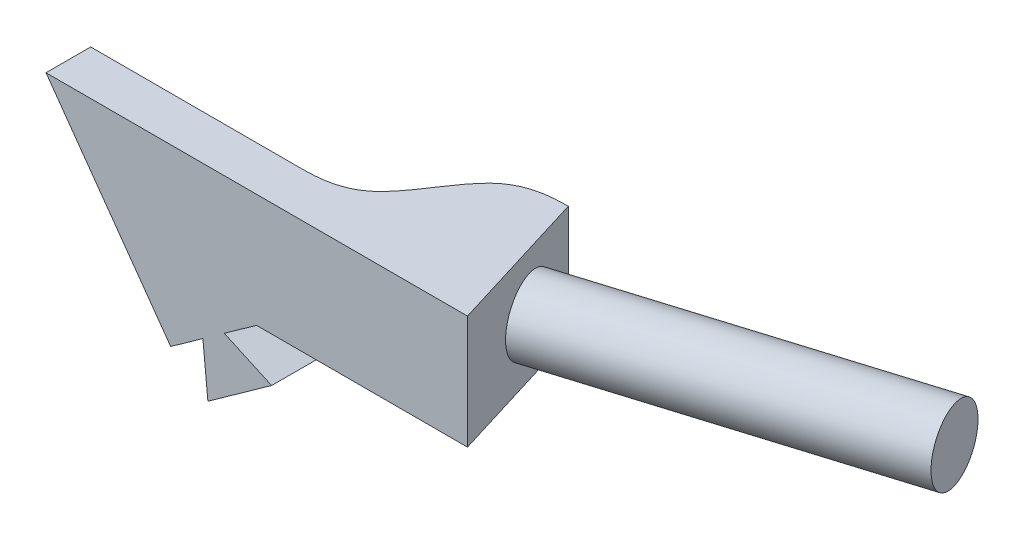
ISO-10303-21;
HEADER;
FILE_DESCRIPTION(('STEP AP214'),'2;1');
FILE_NAME('part.step','',(''),(''),'','','');
FILE_SCHEMA(('AUTOMOTIVE_DESIGN { 1 0 10303 214 1 1 1 1 }'));
ENDSEC;
DATA;
#1=APPLICATION_CONTEXT('core data for automotive mechanical design processes');
#2=APPLICATION_PROTOCOL_DEFINITION('international standard','automotive_design',2000,#1);
#3=PRODUCT_CONTEXT('',#1,'mechanical');
#4=PRODUCT('Part','Part','',(#3));
#5=PRODUCT_RELATED_PRODUCT_CATEGORY('part','',(#4));
#6=PRODUCT_DEFINITION_FORMATION('','',#4);
#7=PRODUCT_DEFINITION_CONTEXT('part definition',#1,'design');
#8=PRODUCT_DEFINITION('design','',#6,#7);
#9=PRODUCT_DEFINITION_SHAPE('','',#8);
#10=(LENGTH_UNIT() NAMED_UNIT(*) SI_UNIT(.MILLI.,.METRE.));
#11=(NAMED_UNIT(*) PLANE_ANGLE_UNIT() SI_UNIT($,.RADIAN.));
#12=(NAMED_UNIT(*) SI_UNIT($,.STERADIAN.) SOLID_ANGLE_UNIT());
#13=UNCERTAINTY_MEASURE_WITH_UNIT(LENGTH_MEASURE(1.E-05),#10,'distance_accuracy_value','');
#14=(GEOMETRIC_REPRESENTATION_CONTEXT(3) GLOBAL_UNCERTAINTY_ASSIGNED_CONTEXT((#13)) GLOBAL_UNIT_ASSIGNED_CONTEXT((#10,
#11,#12)) REPRESENTATION_CONTEXT('',''));
#15=CARTESIAN_POINT('',(0.,0.,0.));
#16=DIRECTION('',(0.,0.,1.));
#17=DIRECTION('',(1.,0.,0.));
#18=AXIS2_PLACEMENT_3D('',#15,#16,#17);
#19=CARTESIAN_POINT('',(-38.1,-12.7,-19.878167));
#20=DIRECTION('',(0.,-1.,0.));
#21=DIRECTION('',(0.,0.,-1.));
#22=AXIS2_PLACEMENT_3D('',#19,#20,#21);
#23=PLANE('',#22);
#24=DIRECTION('',(1.,0.,0.));
#25=VECTOR('',#24,1.);
#26=CARTESIAN_POINT('',(-38.1,-12.7,12.7));
#27=LINE('',#26,#25);
#28=CARTESIAN_POINT('',(-9.1056461346017,-12.7,12.7));
#29=VERTEX_POINT('',#28);
#30=CARTESIAN_POINT('',(38.0999999999999,-12.7,12.7));
#31=VERTEX_POINT('',#30);
#32=EDGE_CURVE('E72',#29,#31,#27,.T.);
#33=ORIENTED_EDGE('',*,*,#32,.F.);
#34=DIRECTION('',(0.,0.,-1.));
#35=VECTOR('',#34,1.);
#36=CARTESIAN_POINT('',(-9.10564613460171,-12.7,44.7712332532875));
#37=LINE('',#36,#35);
#38=CARTESIAN_POINT('',(-9.1056461346017,-12.7,2.7));
#39=VERTEX_POINT('',#38);
#40=EDGE_CURVE('E180',#29,#39,#37,.T.);
#41=ORIENTED_EDGE('',*,*,#40,.T.);
#42=CARTESIAN_POINT('',(28.0956449744943,-12.7,-19.878167));
#43=CARTESIAN_POINT('',(23.2624762333461,-12.7,-19.878167));
#44=CARTESIAN_POINT('',(13.7597257234162,-12.7,-18.3882704900342));
#45=CARTESIAN_POINT('',(5.19295176017358,-12.7,1.21010349003423));
#46=CARTESIAN_POINT('',(-4.18514201423128,-12.7,2.7));
#47=CARTESIAN_POINT('',(-9.1056461346017,-12.7,2.7));
#48=B_SPLINE_CURVE_WITH_KNOTS('',3,(#42,#43,#44,#45,#46,#47),.UNSPECIFIED.,.F.,.F.,(4,1,1,4),
(0.,0.311689084079751,0.688310915920249,1.),.UNSPECIFIED.);
#49=CARTESIAN_POINT('',(28.0956449744943,-12.7,-19.878167));
#50=VERTEX_POINT('',#49);
#51=EDGE_CURVE('E220',#50,#39,#48,.T.);
#52=ORIENTED_EDGE('',*,*,#51,.F.);
#53=DIRECTION('',(0.293557838503509,0.,0.95594131381228));
#54=VECTOR('',#53,1.);
#55=CARTESIAN_POINT('',(31.2527609708644,-12.7,-9.59733910995649));
#56=LINE('',#55,#54);
#57=EDGE_CURVE('E87',#50,#31,#56,.T.);
#58=ORIENTED_EDGE('',*,*,#57,.T.);
#59=EDGE_LOOP('',(#33,#41,#52,#58));
#60=FACE_BOUND('',#59,.T.);
#61=ADVANCED_FACE('F68',(#60),#23,.T.);
#62=CARTESIAN_POINT('',(-38.1,12.7,-19.878167));
#63=DIRECTION('',(0.,1.,0.));
#64=DIRECTION('',(0.,0.,1.));
#65=AXIS2_PLACEMENT_3D('',#62,#63,#64);
#66=PLANE('',#65);
#67=DIRECTION('',(-1.,0.,0.));
#68=VECTOR('',#67,1.);
#69=CARTESIAN_POINT('',(-38.1,12.7,12.7));
#70=LINE('',#69,#68);
#71=CARTESIAN_POINT('',(38.0999999999999,12.7,12.7));
#72=VERTEX_POINT('',#71);
#73=CARTESIAN_POINT('',(-56.2176439245838,12.7,12.7));
#74=VERTEX_POINT('',#73);
#75=EDGE_CURVE('E264',#72,#74,#70,.T.);
#76=ORIENTED_EDGE('',*,*,#75,.F.);
#77=DIRECTION('',(0.293557838503509,0.,0.95594131381228));
#78=VECTOR('',#77,1.);
#79=CARTESIAN_POINT('',(31.2527609708644,12.7,-9.59733910995649));
#80=LINE('',#79,#78);
#81=CARTESIAN_POINT('',(28.0956449744943,12.7,-19.878167));
#82=VERTEX_POINT('',#81);
#83=EDGE_CURVE('E216',#82,#72,#80,.T.);
#84=ORIENTED_EDGE('',*,*,#83,.F.);
#85=CARTESIAN_POINT('',(28.0956449744943,12.7,-19.878167));
#86=CARTESIAN_POINT('',(23.2624762333461,12.7,-19.878167));
#87=CARTESIAN_POINT('',(13.7597257234162,12.7,-18.3882704900342));
#88=CARTESIAN_POINT('',(5.19295176017358,12.7,1.21010349003423));
#89=CARTESIAN_POINT('',(-4.18514201423128,12.7,2.7));
#90=CARTESIAN_POINT('',(-9.1056461346017,12.7,2.7));
#91=B_SPLINE_CURVE_WITH_KNOTS('',3,(#85,#86,#87,#88,#89,#90),.UNSPECIFIED.,.F.,.F.,(4,1,1,4),
(0.,0.311689084079751,0.688310915920249,1.),.UNSPECIFIED.);
#92=CARTESIAN_POINT('',(-9.1056461346017,12.7,2.7));
#93=VERTEX_POINT('',#92);
#94=EDGE_CURVE('E228',#82,#93,#91,.T.);
#95=ORIENTED_EDGE('',*,*,#94,.T.);
#96=DIRECTION('',(-1.,0.,0.));
#97=VECTOR('',#96,1.);
#98=CARTESIAN_POINT('',(-9.1056461346017,12.7,2.7));
#99=LINE('',#98,#97);
#100=CARTESIAN_POINT('',(-56.2176439245837,12.7,2.69999999999999));
#101=VERTEX_POINT('',#100);
#102=EDGE_CURVE('E235',#93,#101,#99,.T.);
#103=ORIENTED_EDGE('',*,*,#102,.T.);
#104=DIRECTION('',(0.,0.,-1.));
#105=VECTOR('',#104,1.);
#106=CARTESIAN_POINT('',(-56.2176439245838,12.7,44.7712332532875));
#107=LINE('',#106,#105);
#108=EDGE_CURVE('E148',#74,#101,#107,.T.);
#109=ORIENTED_EDGE('',*,*,#108,.F.);
#110=EDGE_LOOP('',(#76,#84,#95,#103,#109));
#111=FACE_BOUND('',#110,.T.);
#112=ADVANCED_FACE('F70',(#111),#66,.T.);
#113=CARTESIAN_POINT('',(0.,0.,12.7));
#114=DIRECTION('',(0.,0.,-1.));
#115=DIRECTION('',(-1.,0.,0.));
#116=AXIS2_PLACEMENT_3D('',#113,#114,#115);
#117=PLANE('',#116);
#118=DIRECTION('',(0.,1.,0.));
#119=VECTOR('',#118,1.);
#120=CARTESIAN_POINT('',(38.1,-12.7,12.7));
#121=LINE('',#120,#119);
#122=EDGE_CURVE('E226',#31,#72,#121,.T.);
#123=ORIENTED_EDGE('',*,*,#122,.T.);
#124=ORIENTED_EDGE('',*,*,#75,.T.);
#125=DIRECTION('',(0.580702955710935,-0.814115518356323,0.));
#126=VECTOR('',#125,1.);
#127=CARTESIAN_POINT('',(-31.2561162974647,-22.2947710843639,12.7));
#128=LINE('',#127,#126);
#129=CARTESIAN_POINT('',(-28.3226422061188,-26.4073500836169,12.7));
#130=VERTEX_POINT('',#129);
#131=EDGE_CURVE('E208',#74,#130,#128,.T.);
#132=ORIENTED_EDGE('',*,*,#131,.T.);
#133=DIRECTION('',(0.814115518356323,0.580702955710935,0.));
#134=VECTOR('',#133,1.);
#135=CARTESIAN_POINT('',(2.93347409134594,-4.11257899925302,12.7));
#136=LINE('',#135,#134);
#137=CARTESIAN_POINT('',(-21.108551822586,-21.2615894218606,12.7));
#138=VERTEX_POINT('',#137);
#139=EDGE_CURVE('E164',#130,#138,#136,.T.);
#140=ORIENTED_EDGE('',*,*,#139,.T.);
#141=DIRECTION('',(0.0958457525202137,-0.99539619836718,0.));
#142=VECTOR('',#141,1.);
#143=CARTESIAN_POINT('',(-19.9925459929188,-32.8517531067049,12.7));
#144=LINE('',#143,#142);
#145=CARTESIAN_POINT('',(-19.9925459929188,-32.8517531067049,12.7));
#146=VERTEX_POINT('',#145);
#147=EDGE_CURVE('E181',#138,#146,#144,.T.);
#148=ORIENTED_EDGE('',*,*,#147,.T.);
#149=DIRECTION('',(0.814115518356323,0.580702955710935,0.));
#150=VECTOR('',#149,1.);
#151=CARTESIAN_POINT('',(-5.72435741820585,-22.674353104915,12.7));
#152=LINE('',#151,#150);
#153=CARTESIAN_POINT('',(-5.72435741820585,-22.674353104915,12.7));
#154=VERTEX_POINT('',#153);
#155=EDGE_CURVE('E184',#146,#154,#152,.T.);
#156=ORIENTED_EDGE('',*,*,#155,.T.);
#157=DIRECTION('',(-0.909961270876543,0.41469324265624,0.));
#158=VECTOR('',#157,1.);
#159=CARTESIAN_POINT('',(-16.3197365181345,-17.8457606617563,12.7));
#160=LINE('',#159,#158);
#161=CARTESIAN_POINT('',(-16.3197365181345,-17.8457606617563,12.7));
#162=VERTEX_POINT('',#161);
#163=EDGE_CURVE('E185',#154,#162,#160,.T.);
#164=ORIENTED_EDGE('',*,*,#163,.T.);
#165=EDGE_CURVE('E189',#162,#29,#136,.T.);
#166=ORIENTED_EDGE('',*,*,#165,.T.);
#167=ORIENTED_EDGE('',*,*,#32,.T.);
#168=EDGE_LOOP('',(#123,#124,#132,#140,#148,#156,#164,#166,#167));
#169=FACE_BOUND('',#168,.T.);
#170=ADVANCED_FACE('F245',(#169),#117,.F.);
#171=DIRECTION('',(0.,-1.,0.));
#172=VECTOR('',#171,1.);
#173=SURFACE_OF_LINEAR_EXTRUSION('',#91,#172);
#174=ORIENTED_EDGE('',*,*,#51,.T.);
#175=DIRECTION('',(0.,-1.,0.));
#176=VECTOR('',#175,1.);
#177=CARTESIAN_POINT('',(-9.1056461346017,12.7,2.7));
#178=LINE('',#177,#176);
#179=EDGE_CURVE('E227',#93,#39,#178,.T.);
#180=ORIENTED_EDGE('',*,*,#179,.F.);
#181=ORIENTED_EDGE('',*,*,#94,.F.);
#182=DIRECTION('',(0.,-1.,0.));
#183=VECTOR('',#182,1.);
#184=CARTESIAN_POINT('',(28.0956449744943,12.7,-19.878167));
#185=LINE('',#184,#183);
#186=EDGE_CURVE('E223',#82,#50,#185,.T.);
#187=ORIENTED_EDGE('',*,*,#186,.T.);
#188=EDGE_LOOP('',(#174,#180,#181,#187));
#189=FACE_BOUND('',#188,.T.);
#190=ADVANCED_FACE('F241',(#189),#173,.F.);
#191=CARTESIAN_POINT('',(-9.1056461346017,12.7,2.7));
#192=DIRECTION('',(0.,0.,1.));
#193=DIRECTION('',(1.,0.,0.));
#194=AXIS2_PLACEMENT_3D('',#191,#192,#193);
#195=PLANE('',#194);
#196=ORIENTED_EDGE('',*,*,#179,.T.);
#197=DIRECTION('',(-0.814115518356323,-0.580702955710935,0.));
#198=VECTOR('',#197,1.);
#199=CARTESIAN_POINT('',(2.93347409134595,-4.11257899925302,2.7));
#200=LINE('',#199,#198);
#201=CARTESIAN_POINT('',(-16.3197365181345,-17.8457606617563,2.7));
#202=VERTEX_POINT('',#201);
#203=EDGE_CURVE('E166',#39,#202,#200,.T.);
#204=ORIENTED_EDGE('',*,*,#203,.T.);
#205=DIRECTION('',(0.909961270876543,-0.41469324265624,0.));
#206=VECTOR('',#205,1.);
#207=CARTESIAN_POINT('',(-16.3197365181345,-17.8457606617563,2.7));
#208=LINE('',#207,#206);
#209=CARTESIAN_POINT('',(-5.72435741820585,-22.674353104915,2.7));
#210=VERTEX_POINT('',#209);
#211=EDGE_CURVE('E176',#202,#210,#208,.T.);
#212=ORIENTED_EDGE('',*,*,#211,.T.);
#213=DIRECTION('',(-0.814115518356323,-0.580702955710935,0.));
#214=VECTOR('',#213,1.);
#215=CARTESIAN_POINT('',(-5.72435741820585,-22.674353104915,2.7));
#216=LINE('',#215,#214);
#217=CARTESIAN_POINT('',(-19.9925459929188,-32.8517531067049,2.7));
#218=VERTEX_POINT('',#217);
#219=EDGE_CURVE('E193',#210,#218,#216,.T.);
#220=ORIENTED_EDGE('',*,*,#219,.T.);
#221=DIRECTION('',(-0.0958457525202136,0.99539619836718,0.));
#222=VECTOR('',#221,1.);
#223=CARTESIAN_POINT('',(-19.9925459929188,-32.8517531067049,2.7));
#224=LINE('',#223,#222);
#225=CARTESIAN_POINT('',(-21.108551822586,-21.2615894218606,2.7));
#226=VERTEX_POINT('',#225);
#227=EDGE_CURVE('E161',#218,#226,#224,.T.);
#228=ORIENTED_EDGE('',*,*,#227,.T.);
#229=CARTESIAN_POINT('',(-28.3226422061188,-26.4073500836169,2.7));
#230=VERTEX_POINT('',#229);
#231=EDGE_CURVE('E156',#226,#230,#200,.T.);
#232=ORIENTED_EDGE('',*,*,#231,.T.);
#233=DIRECTION('',(-0.580702955710935,0.814115518356323,0.));
#234=VECTOR('',#233,1.);
#235=CARTESIAN_POINT('',(-31.2561162974647,-22.2947710843639,2.7));
#236=LINE('',#235,#234);
#237=EDGE_CURVE('E141',#230,#101,#236,.T.);
#238=ORIENTED_EDGE('',*,*,#237,.T.);
#239=ORIENTED_EDGE('',*,*,#102,.F.);
#240=EDGE_LOOP('',(#196,#204,#212,#220,#228,#232,#238,#239));
#241=FACE_BOUND('',#240,.T.);
#242=ADVANCED_FACE('F158',(#241),#195,.F.);
#243=CARTESIAN_POINT('',(31.2527609708644,12.7,-9.59733910995649));
#244=DIRECTION('',(0.95594131381228,0.,-0.293557838503509));
#245=DIRECTION('',(-0.293557838503509,0.,-0.95594131381228));
#246=AXIS2_PLACEMENT_3D('',#243,#244,#245);
#247=PLANE('',#246);
#248=CARTESIAN_POINT('',(31.9956602155559,0.,-7.17816310150515));
#249=DIRECTION('',(0.95594131381228,0.,-0.293557838503509));
#250=DIRECTION('',(-0.293557838503509,0.,-0.95594131381228));
#251=AXIS2_PLACEMENT_3D('',#248,#249,#250);
#252=CIRCLE('',#251,7.9375);
#253=CARTESIAN_POINT('',(29.6655448724343,0.,-14.7659472798901));
#254=VERTEX_POINT('',#253);
#255=EDGE_CURVE('E12',#254,#254,#252,.T.);
#256=ORIENTED_EDGE('',*,*,#255,.F.);
#257=EDGE_LOOP('',(#256));
#258=FACE_BOUND('',#257,.T.);
#259=ORIENTED_EDGE('',*,*,#57,.F.);
#260=ORIENTED_EDGE('',*,*,#186,.F.);
#261=ORIENTED_EDGE('',*,*,#83,.T.);
#262=ORIENTED_EDGE('',*,*,#122,.F.);
#263=EDGE_LOOP('',(#259,#260,#261,#262));
#264=FACE_BOUND('',#263,.T.);
#265=ADVANCED_FACE('F247',(#258,#264),#247,.T.);
#266=CARTESIAN_POINT('',(104.838388328052,0.,-29.5472703954725));
#267=DIRECTION('',(-0.95594131381228,0.,0.293557838503509));
#268=DIRECTION('',(0.293557838503509,0.,0.95594131381228));
#269=AXIS2_PLACEMENT_3D('',#266,#267,#268);
#270=CYLINDRICAL_SURFACE('',#269,7.9375);
#271=CARTESIAN_POINT('',(104.838388328052,0.,-29.5472703954725));
#272=DIRECTION('',(0.95594131381228,0.,-0.293557838503509));
#273=DIRECTION('',(-0.293557838503509,0.,-0.95594131381228));
#274=AXIS2_PLACEMENT_3D('',#271,#272,#273);
#275=CIRCLE('',#274,7.9375);
#276=CARTESIAN_POINT('',(102.50827298493,0.,-37.1350545738575));
#277=VERTEX_POINT('',#276);
#278=EDGE_CURVE('E210',#277,#277,#275,.T.);
#279=ORIENTED_EDGE('',*,*,#278,.F.);
#280=EDGE_LOOP('',(#279));
#281=FACE_BOUND('',#280,.T.);
#282=ORIENTED_EDGE('',*,*,#255,.T.);
#283=EDGE_LOOP('',(#282));
#284=FACE_BOUND('',#283,.T.);
#285=ADVANCED_FACE('F287',(#281,#284),#270,.T.);
#286=CARTESIAN_POINT('',(104.838388328052,0.,-29.5472703954725));
#287=DIRECTION('',(0.95594131381228,0.,-0.293557838503509));
#288=DIRECTION('',(-0.293557838503509,0.,-0.95594131381228));
#289=AXIS2_PLACEMENT_3D('',#286,#287,#288);
#290=PLANE('',#289);
#291=ORIENTED_EDGE('',*,*,#278,.T.);
#292=EDGE_LOOP('',(#291));
#293=FACE_BOUND('',#292,.T.);
#294=ADVANCED_FACE('F292',(#293),#290,.T.);
#295=CARTESIAN_POINT('',(-31.2561162974647,-22.2947710843639,44.7712332532875));
#296=DIRECTION('',(-0.814115518356323,-0.580702955710935,0.));
#297=DIRECTION('',(0.580702955710935,-0.814115518356323,0.));
#298=AXIS2_PLACEMENT_3D('',#295,#296,#297);
#299=PLANE('',#298);
#300=ORIENTED_EDGE('',*,*,#131,.F.);
#301=ORIENTED_EDGE('',*,*,#108,.T.);
#302=ORIENTED_EDGE('',*,*,#237,.F.);
#303=DIRECTION('',(0.,0.,-1.));
#304=VECTOR('',#303,1.);
#305=CARTESIAN_POINT('',(-28.3226422061188,-26.4073500836169,44.7712332532875));
#306=LINE('',#305,#304);
#307=EDGE_CURVE('E146',#130,#230,#306,.T.);
#308=ORIENTED_EDGE('',*,*,#307,.F.);
#309=EDGE_LOOP('',(#300,#301,#302,#308));
#310=FACE_BOUND('',#309,.T.);
#311=ADVANCED_FACE('F144',(#310),#299,.T.);
#312=CARTESIAN_POINT('',(2.93347409134594,-4.11257899925302,44.7712332532875));
#313=DIRECTION('',(0.580702955710935,-0.814115518356323,0.));
#314=DIRECTION('',(0.814115518356323,0.580702955710935,0.));
#315=AXIS2_PLACEMENT_3D('',#312,#313,#314);
#316=PLANE('',#315);
#317=ORIENTED_EDGE('',*,*,#165,.F.);
#318=DIRECTION('',(0.,0.,-1.));
#319=VECTOR('',#318,1.);
#320=CARTESIAN_POINT('',(-16.3197365181345,-17.8457606617563,44.7712332532875));
#321=LINE('',#320,#319);
#322=EDGE_CURVE('E171',#162,#202,#321,.T.);
#323=ORIENTED_EDGE('',*,*,#322,.T.);
#324=ORIENTED_EDGE('',*,*,#203,.F.);
#325=ORIENTED_EDGE('',*,*,#40,.F.);
#326=EDGE_LOOP('',(#317,#323,#324,#325));
#327=FACE_BOUND('',#326,.T.);
#328=ADVANCED_FACE('F282',(#327),#316,.T.);
#329=DIRECTION('',(0.,0.,-1.));
#330=VECTOR('',#329,1.);
#331=CARTESIAN_POINT('',(-21.108551822586,-21.2615894218606,44.7712332532875));
#332=LINE('',#331,#330);
#333=EDGE_CURVE('E152',#138,#226,#332,.T.);
#334=ORIENTED_EDGE('',*,*,#333,.F.);
#335=ORIENTED_EDGE('',*,*,#139,.F.);
#336=ORIENTED_EDGE('',*,*,#307,.T.);
#337=ORIENTED_EDGE('',*,*,#231,.F.);
#338=EDGE_LOOP('',(#334,#335,#336,#337));
#339=FACE_BOUND('',#338,.T.);
#340=ADVANCED_FACE('F168',(#339),#316,.T.);
#341=CARTESIAN_POINT('',(-5.72435741820585,-22.674353104915,44.7712332532875));
#342=DIRECTION('',(0.580702955710935,-0.814115518356323,0.));
#343=DIRECTION('',(0.814115518356323,0.580702955710935,0.));
#344=AXIS2_PLACEMENT_3D('',#341,#342,#343);
#345=PLANE('',#344);
#346=ORIENTED_EDGE('',*,*,#155,.F.);
#347=DIRECTION('',(0.,0.,-1.));
#348=VECTOR('',#347,1.);
#349=CARTESIAN_POINT('',(-19.9925459929188,-32.8517531067049,44.7712332532875));
#350=LINE('',#349,#348);
#351=EDGE_CURVE('E201',#146,#218,#350,.T.);
#352=ORIENTED_EDGE('',*,*,#351,.T.);
#353=ORIENTED_EDGE('',*,*,#219,.F.);
#354=DIRECTION('',(0.,0.,-1.));
#355=VECTOR('',#354,1.);
#356=CARTESIAN_POINT('',(-5.72435741820585,-22.674353104915,44.7712332532875));
#357=LINE('',#356,#355);
#358=EDGE_CURVE('E200',#154,#210,#357,.T.);
#359=ORIENTED_EDGE('',*,*,#358,.F.);
#360=EDGE_LOOP('',(#346,#352,#353,#359));
#361=FACE_BOUND('',#360,.T.);
#362=ADVANCED_FACE('F306',(#361),#345,.T.);
#363=CARTESIAN_POINT('',(-16.3197365181345,-17.8457606617563,44.7712332532875));
#364=DIRECTION('',(0.41469324265624,0.909961270876543,0.));
#365=DIRECTION('',(-0.909961270876543,0.41469324265624,0.));
#366=AXIS2_PLACEMENT_3D('',#363,#364,#365);
#367=PLANE('',#366);
#368=ORIENTED_EDGE('',*,*,#163,.F.);
#369=ORIENTED_EDGE('',*,*,#358,.T.);
#370=ORIENTED_EDGE('',*,*,#211,.F.);
#371=ORIENTED_EDGE('',*,*,#322,.F.);
#372=EDGE_LOOP('',(#368,#369,#370,#371));
#373=FACE_BOUND('',#372,.T.);
#374=ADVANCED_FACE('F302',(#373),#367,.T.);
#375=CARTESIAN_POINT('',(-19.9925459929188,-32.8517531067049,44.7712332532875));
#376=DIRECTION('',(-0.99539619836718,-0.0958457525202136,0.));
#377=DIRECTION('',(0.0958457525202137,-0.99539619836718,0.));
#378=AXIS2_PLACEMENT_3D('',#375,#376,#377);
#379=PLANE('',#378);
#380=ORIENTED_EDGE('',*,*,#147,.F.);
#381=ORIENTED_EDGE('',*,*,#333,.T.);
#382=ORIENTED_EDGE('',*,*,#227,.F.);
#383=ORIENTED_EDGE('',*,*,#351,.F.);
#384=EDGE_LOOP('',(#380,#381,#382,#383));
#385=FACE_BOUND('',#384,.T.);
#386=ADVANCED_FACE('F305',(#385),#379,.T.);
#387=CLOSED_SHELL('',(#61,#112,#170,#190,#242,#265,#285,#294,#311,#328,#340,#362,#374,#386));
#388=MANIFOLD_SOLID_BREP('B2',#387);
#389=ADVANCED_BREP_SHAPE_REPRESENTATION('',(#18,#388),#14);
#390=SHAPE_DEFINITION_REPRESENTATION(#9,#389);
ENDSEC;
END-ISO-10303-21;
